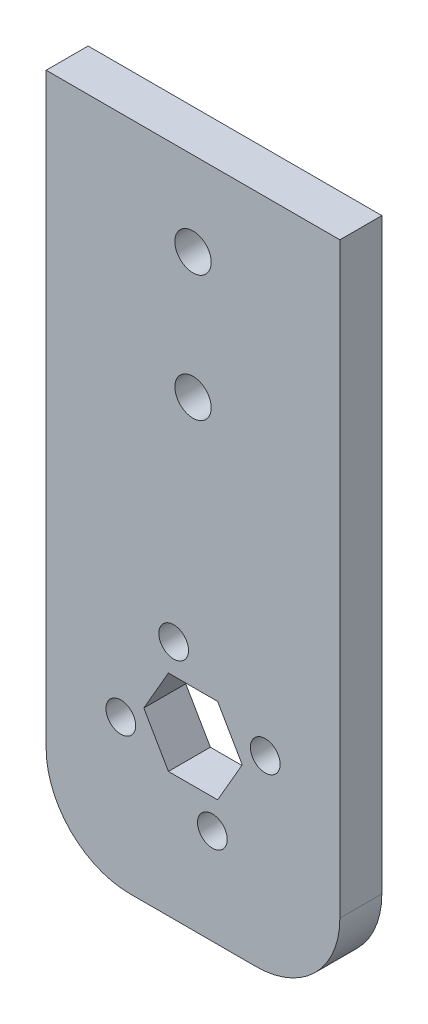
ISO-10303-21;
HEADER;
FILE_DESCRIPTION(('STEP AP214'),'2;1');
FILE_NAME('part.step','',(''),(''),'','','');
FILE_SCHEMA(('AUTOMOTIVE_DESIGN { 1 0 10303 214 1 1 1 1 }'));
ENDSEC;
DATA;
#1=APPLICATION_CONTEXT('core data for automotive mechanical design processes');
#2=APPLICATION_PROTOCOL_DEFINITION('international standard','automotive_design',2000,#1);
#3=PRODUCT_CONTEXT('',#1,'mechanical');
#4=PRODUCT('Part','Part','',(#3));
#5=PRODUCT_RELATED_PRODUCT_CATEGORY('part','',(#4));
#6=PRODUCT_DEFINITION_FORMATION('','',#4);
#7=PRODUCT_DEFINITION_CONTEXT('part definition',#1,'design');
#8=PRODUCT_DEFINITION('design','',#6,#7);
#9=PRODUCT_DEFINITION_SHAPE('','',#8);
#10=(LENGTH_UNIT() NAMED_UNIT(*) SI_UNIT(.MILLI.,.METRE.));
#11=(NAMED_UNIT(*) PLANE_ANGLE_UNIT() SI_UNIT($,.RADIAN.));
#12=(NAMED_UNIT(*) SI_UNIT($,.STERADIAN.) SOLID_ANGLE_UNIT());
#13=UNCERTAINTY_MEASURE_WITH_UNIT(LENGTH_MEASURE(1.E-05),#10,'distance_accuracy_value','');
#14=(GEOMETRIC_REPRESENTATION_CONTEXT(3) GLOBAL_UNCERTAINTY_ASSIGNED_CONTEXT((#13)) GLOBAL_UNIT_ASSIGNED_CONTEXT((#10,
#11,#12)) REPRESENTATION_CONTEXT('',''));
#15=CARTESIAN_POINT('',(0.,0.,0.));
#16=DIRECTION('',(0.,0.,1.));
#17=DIRECTION('',(1.,0.,0.));
#18=AXIS2_PLACEMENT_3D('',#15,#16,#17);
#19=CARTESIAN_POINT('',(0.,0.,6.35));
#20=DIRECTION('',(-1.,0.,0.));
#21=DIRECTION('',(0.,0.,1.));
#22=AXIS2_PLACEMENT_3D('',#19,#20,#21);
#23=PLANE('',#22);
#24=DIRECTION('',(0.,1.,0.));
#25=VECTOR('',#24,1.);
#26=CARTESIAN_POINT('',(0.,0.,6.35));
#27=LINE('',#26,#25);
#28=CARTESIAN_POINT('',(0.,12.7,6.35));
#29=VERTEX_POINT('',#28);
#30=CARTESIAN_POINT('',(0.,101.6,6.35));
#31=VERTEX_POINT('',#30);
#32=EDGE_CURVE('E194',#29,#31,#27,.T.);
#33=ORIENTED_EDGE('',*,*,#32,.F.);
#34=DIRECTION('',(0.,0.,-1.));
#35=VECTOR('',#34,1.);
#36=CARTESIAN_POINT('',(0.,12.7,6.35));
#37=LINE('',#36,#35);
#38=CARTESIAN_POINT('',(0.,12.7,0.));
#39=VERTEX_POINT('',#38);
#40=EDGE_CURVE('E11',#29,#39,#37,.T.);
#41=ORIENTED_EDGE('',*,*,#40,.T.);
#42=DIRECTION('',(0.,1.,0.));
#43=VECTOR('',#42,1.);
#44=CARTESIAN_POINT('',(0.,0.,0.));
#45=LINE('',#44,#43);
#46=CARTESIAN_POINT('',(0.,101.6,0.));
#47=VERTEX_POINT('',#46);
#48=EDGE_CURVE('E193',#39,#47,#45,.T.);
#49=ORIENTED_EDGE('',*,*,#48,.T.);
#50=DIRECTION('',(0.,0.,-1.));
#51=VECTOR('',#50,1.);
#52=CARTESIAN_POINT('',(0.,101.6,6.35));
#53=LINE('',#52,#51);
#54=EDGE_CURVE('E216',#31,#47,#53,.T.);
#55=ORIENTED_EDGE('',*,*,#54,.F.);
#56=EDGE_LOOP('',(#33,#41,#49,#55));
#57=FACE_BOUND('',#56,.T.);
#58=ADVANCED_FACE('F37',(#57),#23,.F.);
#59=CARTESIAN_POINT('',(0.,101.6,6.35));
#60=DIRECTION('',(0.,-1.,0.));
#61=DIRECTION('',(0.,0.,-1.));
#62=AXIS2_PLACEMENT_3D('',#59,#60,#61);
#63=PLANE('',#62);
#64=DIRECTION('',(-1.,0.,0.));
#65=VECTOR('',#64,1.);
#66=CARTESIAN_POINT('',(0.,101.6,0.));
#67=LINE('',#66,#65);
#68=CARTESIAN_POINT('',(-44.45,101.6,0.));
#69=VERTEX_POINT('',#68);
#70=EDGE_CURVE('E207',#47,#69,#67,.T.);
#71=ORIENTED_EDGE('',*,*,#70,.T.);
#72=DIRECTION('',(0.,0.,-1.));
#73=VECTOR('',#72,1.);
#74=CARTESIAN_POINT('',(-44.45,101.6,6.35));
#75=LINE('',#74,#73);
#76=CARTESIAN_POINT('',(-44.45,101.6,6.35));
#77=VERTEX_POINT('',#76);
#78=EDGE_CURVE('E205',#77,#69,#75,.T.);
#79=ORIENTED_EDGE('',*,*,#78,.F.);
#80=DIRECTION('',(-1.,0.,0.));
#81=VECTOR('',#80,1.);
#82=CARTESIAN_POINT('',(0.,101.6,6.35));
#83=LINE('',#82,#81);
#84=EDGE_CURVE('E196',#31,#77,#83,.T.);
#85=ORIENTED_EDGE('',*,*,#84,.F.);
#86=ORIENTED_EDGE('',*,*,#54,.T.);
#87=EDGE_LOOP('',(#71,#79,#85,#86));
#88=FACE_BOUND('',#87,.T.);
#89=ADVANCED_FACE('F253',(#88),#63,.F.);
#90=CARTESIAN_POINT('',(-44.45,0.,6.35));
#91=DIRECTION('',(1.,0.,0.));
#92=DIRECTION('',(0.,0.,-1.));
#93=AXIS2_PLACEMENT_3D('',#90,#91,#92);
#94=PLANE('',#93);
#95=DIRECTION('',(0.,-1.,0.));
#96=VECTOR('',#95,1.);
#97=CARTESIAN_POINT('',(-44.45,0.,0.));
#98=LINE('',#97,#96);
#99=CARTESIAN_POINT('',(-44.45,12.7,0.));
#100=VERTEX_POINT('',#99);
#101=EDGE_CURVE('E209',#69,#100,#98,.T.);
#102=ORIENTED_EDGE('',*,*,#101,.T.);
#103=DIRECTION('',(0.,0.,-1.));
#104=VECTOR('',#103,1.);
#105=CARTESIAN_POINT('',(-44.45,12.7,6.35));
#106=LINE('',#105,#104);
#107=CARTESIAN_POINT('',(-44.45,12.7,6.35));
#108=VERTEX_POINT('',#107);
#109=EDGE_CURVE('E228',#100,#108,#106,.F.);
#110=ORIENTED_EDGE('',*,*,#109,.T.);
#111=DIRECTION('',(0.,-1.,0.));
#112=VECTOR('',#111,1.);
#113=CARTESIAN_POINT('',(-44.45,0.,6.35));
#114=LINE('',#113,#112);
#115=EDGE_CURVE('E199',#77,#108,#114,.T.);
#116=ORIENTED_EDGE('',*,*,#115,.F.);
#117=ORIENTED_EDGE('',*,*,#78,.T.);
#118=EDGE_LOOP('',(#102,#110,#116,#117));
#119=FACE_BOUND('',#118,.T.);
#120=ADVANCED_FACE('F249',(#119),#94,.F.);
#121=CARTESIAN_POINT('',(0.,0.,6.35));
#122=DIRECTION('',(0.,1.,0.));
#123=DIRECTION('',(0.,0.,1.));
#124=AXIS2_PLACEMENT_3D('',#121,#122,#123);
#125=PLANE('',#124);
#126=DIRECTION('',(1.,0.,0.));
#127=VECTOR('',#126,1.);
#128=CARTESIAN_POINT('',(0.,0.,6.35));
#129=LINE('',#128,#127);
#130=CARTESIAN_POINT('',(-31.75,0.,6.35));
#131=VERTEX_POINT('',#130);
#132=CARTESIAN_POINT('',(-12.7,0.,6.35));
#133=VERTEX_POINT('',#132);
#134=EDGE_CURVE('E202',#131,#133,#129,.T.);
#135=ORIENTED_EDGE('',*,*,#134,.F.);
#136=DIRECTION('',(0.,0.,-1.));
#137=VECTOR('',#136,1.);
#138=CARTESIAN_POINT('',(-31.75,0.,6.35));
#139=LINE('',#138,#137);
#140=CARTESIAN_POINT('',(-31.75,0.,0.));
#141=VERTEX_POINT('',#140);
#142=EDGE_CURVE('E221',#131,#141,#139,.T.);
#143=ORIENTED_EDGE('',*,*,#142,.T.);
#144=DIRECTION('',(1.,0.,0.));
#145=VECTOR('',#144,1.);
#146=CARTESIAN_POINT('',(0.,0.,0.));
#147=LINE('',#146,#145);
#148=CARTESIAN_POINT('',(-12.7,0.,0.));
#149=VERTEX_POINT('',#148);
#150=EDGE_CURVE('E197',#141,#149,#147,.T.);
#151=ORIENTED_EDGE('',*,*,#150,.T.);
#152=DIRECTION('',(0.,0.,-1.));
#153=VECTOR('',#152,1.);
#154=CARTESIAN_POINT('',(-12.7,0.,6.35));
#155=LINE('',#154,#153);
#156=EDGE_CURVE('E219',#149,#133,#155,.F.);
#157=ORIENTED_EDGE('',*,*,#156,.T.);
#158=EDGE_LOOP('',(#135,#143,#151,#157));
#159=FACE_BOUND('',#158,.T.);
#160=ADVANCED_FACE('F241',(#159),#125,.F.);
#161=CARTESIAN_POINT('',(0.,0.,6.35));
#162=DIRECTION('',(0.,0.,1.));
#163=DIRECTION('',(1.,0.,0.));
#164=AXIS2_PLACEMENT_3D('',#161,#162,#163);
#165=PLANE('',#164);
#166=CARTESIAN_POINT('',(-11.2967967697244,28.3282032302755,6.35));
#167=DIRECTION('',(0.,0.,-1.));
#168=DIRECTION('',(-1.,0.,0.));
#169=AXIS2_PLACEMENT_3D('',#166,#167,#168);
#170=CIRCLE('',#169,2.25);
#171=CARTESIAN_POINT('',(-13.5467967697244,28.3282032302755,6.35));
#172=VERTEX_POINT('',#171);
#173=EDGE_CURVE('E328',#172,#172,#170,.T.);
#174=ORIENTED_EDGE('',*,*,#173,.T.);
#175=EDGE_LOOP('',(#174));
#176=FACE_BOUND('',#175,.T.);
#177=CARTESIAN_POINT('',(-25.1532032302754,36.3282032302756,6.35));
#178=DIRECTION('',(0.,0.,-1.));
#179=DIRECTION('',(-1.,0.,0.));
#180=AXIS2_PLACEMENT_3D('',#177,#178,#179);
#181=CIRCLE('',#180,2.25);
#182=CARTESIAN_POINT('',(-27.4032032302754,36.3282032302756,6.35));
#183=VERTEX_POINT('',#182);
#184=EDGE_CURVE('E338',#183,#183,#181,.T.);
#185=ORIENTED_EDGE('',*,*,#184,.T.);
#186=EDGE_LOOP('',(#185));
#187=FACE_BOUND('',#186,.T.);
#188=CARTESIAN_POINT('',(-33.1532032302755,22.4717967697245,6.35));
#189=DIRECTION('',(0.,0.,-1.));
#190=DIRECTION('',(-1.,0.,0.));
#191=AXIS2_PLACEMENT_3D('',#188,#189,#190);
#192=CIRCLE('',#191,2.25);
#193=CARTESIAN_POINT('',(-35.4032032302755,22.4717967697245,6.35));
#194=VERTEX_POINT('',#193);
#195=EDGE_CURVE('E344',#194,#194,#192,.T.);
#196=ORIENTED_EDGE('',*,*,#195,.T.);
#197=EDGE_LOOP('',(#196));
#198=FACE_BOUND('',#197,.T.);
#199=CARTESIAN_POINT('',(-19.2967967697245,14.4717967697245,6.35));
#200=DIRECTION('',(0.,0.,-1.));
#201=DIRECTION('',(-1.,0.,0.));
#202=AXIS2_PLACEMENT_3D('',#199,#200,#201);
#203=CIRCLE('',#202,2.25);
#204=CARTESIAN_POINT('',(-21.5467967697245,14.4717967697245,6.35));
#205=VERTEX_POINT('',#204);
#206=EDGE_CURVE('E151',#205,#205,#203,.T.);
#207=ORIENTED_EDGE('',*,*,#206,.T.);
#208=EDGE_LOOP('',(#207));
#209=FACE_BOUND('',#208,.T.);
#210=DIRECTION('',(0.500000000000001,0.866025403784438,0.));
#211=VECTOR('',#210,1.);
#212=CARTESIAN_POINT('',(-18.5010907637269,18.95,6.35));
#213=LINE('',#212,#211);
#214=CARTESIAN_POINT('',(-18.5010907637269,18.95,6.35));
#215=VERTEX_POINT('',#214);
#216=CARTESIAN_POINT('',(-14.7771815274538,25.4,6.35));
#217=VERTEX_POINT('',#216);
#218=EDGE_CURVE('E52',#215,#217,#213,.T.);
#219=ORIENTED_EDGE('',*,*,#218,.F.);
#220=DIRECTION('',(1.,0.,0.));
#221=VECTOR('',#220,1.);
#222=CARTESIAN_POINT('',(-25.9489092362731,18.95,6.35));
#223=LINE('',#222,#221);
#224=CARTESIAN_POINT('',(-25.9489092362731,18.95,6.35));
#225=VERTEX_POINT('',#224);
#226=EDGE_CURVE('E145',#225,#215,#223,.T.);
#227=ORIENTED_EDGE('',*,*,#226,.F.);
#228=DIRECTION('',(0.499999999999999,-0.866025403784439,0.));
#229=VECTOR('',#228,1.);
#230=CARTESIAN_POINT('',(-29.6728184725462,25.4,6.35));
#231=LINE('',#230,#229);
#232=CARTESIAN_POINT('',(-29.6728184725462,25.4,6.35));
#233=VERTEX_POINT('',#232);
#234=EDGE_CURVE('E148',#233,#225,#231,.T.);
#235=ORIENTED_EDGE('',*,*,#234,.F.);
#236=DIRECTION('',(-0.500000000000001,-0.866025403784438,0.));
#237=VECTOR('',#236,1.);
#238=CARTESIAN_POINT('',(-25.9489092362731,31.85,6.35));
#239=LINE('',#238,#237);
#240=CARTESIAN_POINT('',(-25.9489092362731,31.85,6.35));
#241=VERTEX_POINT('',#240);
#242=EDGE_CURVE('E167',#241,#233,#239,.T.);
#243=ORIENTED_EDGE('',*,*,#242,.F.);
#244=DIRECTION('',(-1.,0.,0.));
#245=VECTOR('',#244,1.);
#246=CARTESIAN_POINT('',(-18.5010907637269,31.85,6.35));
#247=LINE('',#246,#245);
#248=CARTESIAN_POINT('',(-18.5010907637269,31.85,6.35));
#249=VERTEX_POINT('',#248);
#250=EDGE_CURVE('E164',#249,#241,#247,.T.);
#251=ORIENTED_EDGE('',*,*,#250,.F.);
#252=DIRECTION('',(-0.499999999999999,0.866025403784439,0.));
#253=VECTOR('',#252,1.);
#254=CARTESIAN_POINT('',(-14.7771815274538,25.4,6.35));
#255=LINE('',#254,#253);
#256=EDGE_CURVE('E162',#217,#249,#255,.T.);
#257=ORIENTED_EDGE('',*,*,#256,.F.);
#258=EDGE_LOOP('',(#219,#227,#235,#243,#251,#257));
#259=FACE_BOUND('',#258,.T.);
#260=CARTESIAN_POINT('',(-22.225,88.9,6.35));
#261=DIRECTION('',(0.,0.,-1.));
#262=DIRECTION('',(-1.,0.,0.));
#263=AXIS2_PLACEMENT_3D('',#260,#261,#262);
#264=CIRCLE('',#263,2.75);
#265=CARTESIAN_POINT('',(-24.975,88.9,6.35));
#266=VERTEX_POINT('',#265);
#267=EDGE_CURVE('E184',#266,#266,#264,.T.);
#268=ORIENTED_EDGE('',*,*,#267,.T.);
#269=EDGE_LOOP('',(#268));
#270=FACE_BOUND('',#269,.T.);
#271=CARTESIAN_POINT('',(-22.225,69.85,6.35));
#272=DIRECTION('',(0.,0.,-1.));
#273=DIRECTION('',(-1.,0.,0.));
#274=AXIS2_PLACEMENT_3D('',#271,#272,#273);
#275=CIRCLE('',#274,2.75);
#276=CARTESIAN_POINT('',(-24.975,69.85,6.35));
#277=VERTEX_POINT('',#276);
#278=EDGE_CURVE('E190',#277,#277,#275,.T.);
#279=ORIENTED_EDGE('',*,*,#278,.T.);
#280=EDGE_LOOP('',(#279));
#281=FACE_BOUND('',#280,.T.);
#282=ORIENTED_EDGE('',*,*,#115,.T.);
#283=CARTESIAN_POINT('',(-31.75,12.7,6.35));
#284=DIRECTION('',(0.,0.,1.));
#285=DIRECTION('',(1.,0.,0.));
#286=AXIS2_PLACEMENT_3D('',#283,#284,#285);
#287=CIRCLE('',#286,12.7);
#288=EDGE_CURVE('E45',#108,#131,#287,.T.);
#289=ORIENTED_EDGE('',*,*,#288,.T.);
#290=ORIENTED_EDGE('',*,*,#134,.T.);
#291=CARTESIAN_POINT('',(-12.7,12.7,6.35));
#292=DIRECTION('',(0.,0.,1.));
#293=DIRECTION('',(1.,0.,0.));
#294=AXIS2_PLACEMENT_3D('',#291,#292,#293);
#295=CIRCLE('',#294,12.7);
#296=EDGE_CURVE('E230',#133,#29,#295,.T.);
#297=ORIENTED_EDGE('',*,*,#296,.T.);
#298=ORIENTED_EDGE('',*,*,#32,.T.);
#299=ORIENTED_EDGE('',*,*,#84,.T.);
#300=EDGE_LOOP('',(#282,#289,#290,#297,#298,#299));
#301=FACE_BOUND('',#300,.T.);
#302=ADVANCED_FACE('F234',(#176,#187,#198,#209,#259,#270,#281,#301),#165,.T.);
#303=CARTESIAN_POINT('',(0.,0.,0.));
#304=DIRECTION('',(0.,0.,1.));
#305=DIRECTION('',(1.,0.,0.));
#306=AXIS2_PLACEMENT_3D('',#303,#304,#305);
#307=PLANE('',#306);
#308=CARTESIAN_POINT('',(-11.2967967697244,28.3282032302755,0.));
#309=DIRECTION('',(0.,0.,-1.));
#310=DIRECTION('',(-1.,0.,0.));
#311=AXIS2_PLACEMENT_3D('',#308,#309,#310);
#312=CIRCLE('',#311,2.25);
#313=CARTESIAN_POINT('',(-13.5467967697244,28.3282032302755,0.));
#314=VERTEX_POINT('',#313);
#315=EDGE_CURVE('E331',#314,#314,#312,.T.);
#316=ORIENTED_EDGE('',*,*,#315,.F.);
#317=EDGE_LOOP('',(#316));
#318=FACE_BOUND('',#317,.T.);
#319=CARTESIAN_POINT('',(-25.1532032302754,36.3282032302756,0.));
#320=DIRECTION('',(0.,0.,-1.));
#321=DIRECTION('',(-1.,0.,0.));
#322=AXIS2_PLACEMENT_3D('',#319,#320,#321);
#323=CIRCLE('',#322,2.25);
#324=CARTESIAN_POINT('',(-27.4032032302754,36.3282032302756,0.));
#325=VERTEX_POINT('',#324);
#326=EDGE_CURVE('E333',#325,#325,#323,.T.);
#327=ORIENTED_EDGE('',*,*,#326,.F.);
#328=EDGE_LOOP('',(#327));
#329=FACE_BOUND('',#328,.T.);
#330=CARTESIAN_POINT('',(-33.1532032302755,22.4717967697245,0.));
#331=DIRECTION('',(0.,0.,-1.));
#332=DIRECTION('',(-1.,0.,0.));
#333=AXIS2_PLACEMENT_3D('',#330,#331,#332);
#334=CIRCLE('',#333,2.25);
#335=CARTESIAN_POINT('',(-35.4032032302755,22.4717967697245,0.));
#336=VERTEX_POINT('',#335);
#337=EDGE_CURVE('E341',#336,#336,#334,.T.);
#338=ORIENTED_EDGE('',*,*,#337,.F.);
#339=EDGE_LOOP('',(#338));
#340=FACE_BOUND('',#339,.T.);
#341=CARTESIAN_POINT('',(-19.2967967697245,14.4717967697245,0.));
#342=DIRECTION('',(0.,0.,-1.));
#343=DIRECTION('',(-1.,0.,0.));
#344=AXIS2_PLACEMENT_3D('',#341,#342,#343);
#345=CIRCLE('',#344,2.25);
#346=CARTESIAN_POINT('',(-21.5467967697245,14.4717967697245,0.));
#347=VERTEX_POINT('',#346);
#348=EDGE_CURVE('E346',#347,#347,#345,.T.);
#349=ORIENTED_EDGE('',*,*,#348,.F.);
#350=EDGE_LOOP('',(#349));
#351=FACE_BOUND('',#350,.T.);
#352=DIRECTION('',(1.,0.,0.));
#353=VECTOR('',#352,1.);
#354=CARTESIAN_POINT('',(-25.9489092362731,18.95,0.));
#355=LINE('',#354,#353);
#356=CARTESIAN_POINT('',(-25.9489092362731,18.95,0.));
#357=VERTEX_POINT('',#356);
#358=CARTESIAN_POINT('',(-18.5010907637269,18.95,0.));
#359=VERTEX_POINT('',#358);
#360=EDGE_CURVE('E134',#357,#359,#355,.T.);
#361=ORIENTED_EDGE('',*,*,#360,.T.);
#362=DIRECTION('',(0.500000000000001,0.866025403784438,0.));
#363=VECTOR('',#362,1.);
#364=CARTESIAN_POINT('',(-18.5010907637269,18.95,0.));
#365=LINE('',#364,#363);
#366=CARTESIAN_POINT('',(-14.7771815274538,25.4,0.));
#367=VERTEX_POINT('',#366);
#368=EDGE_CURVE('E128',#359,#367,#365,.T.);
#369=ORIENTED_EDGE('',*,*,#368,.T.);
#370=DIRECTION('',(-0.499999999999999,0.866025403784439,0.));
#371=VECTOR('',#370,1.);
#372=CARTESIAN_POINT('',(-14.7771815274538,25.4,0.));
#373=LINE('',#372,#371);
#374=CARTESIAN_POINT('',(-18.5010907637269,31.85,0.));
#375=VERTEX_POINT('',#374);
#376=EDGE_CURVE('E137',#367,#375,#373,.T.);
#377=ORIENTED_EDGE('',*,*,#376,.T.);
#378=DIRECTION('',(-1.,0.,0.));
#379=VECTOR('',#378,1.);
#380=CARTESIAN_POINT('',(-18.5010907637269,31.85,0.));
#381=LINE('',#380,#379);
#382=CARTESIAN_POINT('',(-25.9489092362731,31.85,0.));
#383=VERTEX_POINT('',#382);
#384=EDGE_CURVE('E60',#375,#383,#381,.T.);
#385=ORIENTED_EDGE('',*,*,#384,.T.);
#386=DIRECTION('',(-0.500000000000001,-0.866025403784438,0.));
#387=VECTOR('',#386,1.);
#388=CARTESIAN_POINT('',(-25.9489092362731,31.85,0.));
#389=LINE('',#388,#387);
#390=CARTESIAN_POINT('',(-29.6728184725462,25.4,0.));
#391=VERTEX_POINT('',#390);
#392=EDGE_CURVE('E155',#383,#391,#389,.T.);
#393=ORIENTED_EDGE('',*,*,#392,.T.);
#394=DIRECTION('',(0.499999999999999,-0.866025403784439,0.));
#395=VECTOR('',#394,1.);
#396=CARTESIAN_POINT('',(-29.6728184725462,25.4,0.));
#397=LINE('',#396,#395);
#398=EDGE_CURVE('E158',#391,#357,#397,.T.);
#399=ORIENTED_EDGE('',*,*,#398,.T.);
#400=EDGE_LOOP('',(#361,#369,#377,#385,#393,#399));
#401=FACE_BOUND('',#400,.T.);
#402=CARTESIAN_POINT('',(-22.225,88.9,0.));
#403=DIRECTION('',(0.,0.,-1.));
#404=DIRECTION('',(-1.,0.,0.));
#405=AXIS2_PLACEMENT_3D('',#402,#403,#404);
#406=CIRCLE('',#405,2.75);
#407=CARTESIAN_POINT('',(-24.975,88.9,0.));
#408=VERTEX_POINT('',#407);
#409=EDGE_CURVE('E174',#408,#408,#406,.T.);
#410=ORIENTED_EDGE('',*,*,#409,.F.);
#411=EDGE_LOOP('',(#410));
#412=FACE_BOUND('',#411,.T.);
#413=CARTESIAN_POINT('',(-22.225,69.85,0.));
#414=DIRECTION('',(0.,0.,-1.));
#415=DIRECTION('',(-1.,0.,0.));
#416=AXIS2_PLACEMENT_3D('',#413,#414,#415);
#417=CIRCLE('',#416,2.75);
#418=CARTESIAN_POINT('',(-24.975,69.85,0.));
#419=VERTEX_POINT('',#418);
#420=EDGE_CURVE('E187',#419,#419,#417,.T.);
#421=ORIENTED_EDGE('',*,*,#420,.F.);
#422=EDGE_LOOP('',(#421));
#423=FACE_BOUND('',#422,.T.);
#424=ORIENTED_EDGE('',*,*,#150,.F.);
#425=CARTESIAN_POINT('',(-31.75,12.7,0.));
#426=DIRECTION('',(0.,0.,1.));
#427=DIRECTION('',(1.,0.,0.));
#428=AXIS2_PLACEMENT_3D('',#425,#426,#427);
#429=CIRCLE('',#428,12.7);
#430=EDGE_CURVE('E226',#141,#100,#429,.F.);
#431=ORIENTED_EDGE('',*,*,#430,.T.);
#432=ORIENTED_EDGE('',*,*,#101,.F.);
#433=ORIENTED_EDGE('',*,*,#70,.F.);
#434=ORIENTED_EDGE('',*,*,#48,.F.);
#435=CARTESIAN_POINT('',(-12.7,12.7,0.));
#436=DIRECTION('',(0.,0.,1.));
#437=DIRECTION('',(1.,0.,0.));
#438=AXIS2_PLACEMENT_3D('',#435,#436,#437);
#439=CIRCLE('',#438,12.7);
#440=EDGE_CURVE('E224',#39,#149,#439,.F.);
#441=ORIENTED_EDGE('',*,*,#440,.T.);
#442=EDGE_LOOP('',(#424,#431,#432,#433,#434,#441));
#443=FACE_BOUND('',#442,.T.);
#444=ADVANCED_FACE('F141',(#318,#329,#340,#351,#401,#412,#423,#443),#307,.F.);
#445=CARTESIAN_POINT('',(-31.75,12.7,6.35));
#446=DIRECTION('',(0.,0.,-1.));
#447=DIRECTION('',(-1.,0.,0.));
#448=AXIS2_PLACEMENT_3D('',#445,#446,#447);
#449=CYLINDRICAL_SURFACE('',#448,12.7);
#450=ORIENTED_EDGE('',*,*,#288,.F.);
#451=ORIENTED_EDGE('',*,*,#109,.F.);
#452=ORIENTED_EDGE('',*,*,#430,.F.);
#453=ORIENTED_EDGE('',*,*,#142,.F.);
#454=EDGE_LOOP('',(#450,#451,#452,#453));
#455=FACE_BOUND('',#454,.T.);
#456=ADVANCED_FACE('F244',(#455),#449,.T.);
#457=CARTESIAN_POINT('',(-12.7,12.7,6.35));
#458=DIRECTION('',(0.,0.,-1.));
#459=DIRECTION('',(-1.,0.,0.));
#460=AXIS2_PLACEMENT_3D('',#457,#458,#459);
#461=CYLINDRICAL_SURFACE('',#460,12.7);
#462=ORIENTED_EDGE('',*,*,#296,.F.);
#463=ORIENTED_EDGE('',*,*,#156,.F.);
#464=ORIENTED_EDGE('',*,*,#440,.F.);
#465=ORIENTED_EDGE('',*,*,#40,.F.);
#466=EDGE_LOOP('',(#462,#463,#464,#465));
#467=FACE_BOUND('',#466,.T.);
#468=ADVANCED_FACE('F39',(#467),#461,.T.);
#469=CARTESIAN_POINT('',(-22.225,69.85,0.));
#470=DIRECTION('',(0.,0.,-1.));
#471=DIRECTION('',(-1.,0.,0.));
#472=AXIS2_PLACEMENT_3D('',#469,#470,#471);
#473=CYLINDRICAL_SURFACE('',#472,2.75);
#474=ORIENTED_EDGE('',*,*,#278,.F.);
#475=EDGE_LOOP('',(#474));
#476=FACE_BOUND('',#475,.T.);
#477=ORIENTED_EDGE('',*,*,#420,.T.);
#478=EDGE_LOOP('',(#477));
#479=FACE_BOUND('',#478,.T.);
#480=ADVANCED_FACE('F261',(#476,#479),#473,.F.);
#481=CARTESIAN_POINT('',(-22.225,88.9,0.));
#482=DIRECTION('',(0.,0.,-1.));
#483=DIRECTION('',(-1.,0.,0.));
#484=AXIS2_PLACEMENT_3D('',#481,#482,#483);
#485=CYLINDRICAL_SURFACE('',#484,2.75);
#486=ORIENTED_EDGE('',*,*,#267,.F.);
#487=EDGE_LOOP('',(#486));
#488=FACE_BOUND('',#487,.T.);
#489=ORIENTED_EDGE('',*,*,#409,.T.);
#490=EDGE_LOOP('',(#489));
#491=FACE_BOUND('',#490,.T.);
#492=ADVANCED_FACE('F266',(#488,#491),#485,.F.);
#493=CARTESIAN_POINT('',(-18.5010907637269,18.95,0.));
#494=DIRECTION('',(0.866025403784438,-0.500000000000001,0.));
#495=DIRECTION('',(0.500000000000001,0.866025403784438,0.));
#496=AXIS2_PLACEMENT_3D('',#493,#494,#495);
#497=PLANE('',#496);
#498=ORIENTED_EDGE('',*,*,#218,.T.);
#499=DIRECTION('',(0.,0.,1.));
#500=VECTOR('',#499,1.);
#501=CARTESIAN_POINT('',(-14.7771815274538,25.4,0.));
#502=LINE('',#501,#500);
#503=EDGE_CURVE('E124',#367,#217,#502,.T.);
#504=ORIENTED_EDGE('',*,*,#503,.F.);
#505=ORIENTED_EDGE('',*,*,#368,.F.);
#506=DIRECTION('',(0.,0.,1.));
#507=VECTOR('',#506,1.);
#508=CARTESIAN_POINT('',(-18.5010907637269,18.95,0.));
#509=LINE('',#508,#507);
#510=EDGE_CURVE('E172',#359,#215,#509,.T.);
#511=ORIENTED_EDGE('',*,*,#510,.T.);
#512=EDGE_LOOP('',(#498,#504,#505,#511));
#513=FACE_BOUND('',#512,.T.);
#514=ADVANCED_FACE('F126',(#513),#497,.F.);
#515=CARTESIAN_POINT('',(-25.9489092362731,18.95,0.));
#516=DIRECTION('',(0.,-1.,0.));
#517=DIRECTION('',(1.,0.,0.));
#518=AXIS2_PLACEMENT_3D('',#515,#516,#517);
#519=PLANE('',#518);
#520=ORIENTED_EDGE('',*,*,#226,.T.);
#521=ORIENTED_EDGE('',*,*,#510,.F.);
#522=ORIENTED_EDGE('',*,*,#360,.F.);
#523=DIRECTION('',(0.,0.,1.));
#524=VECTOR('',#523,1.);
#525=CARTESIAN_POINT('',(-25.9489092362731,18.95,0.));
#526=LINE('',#525,#524);
#527=EDGE_CURVE('E175',#357,#225,#526,.T.);
#528=ORIENTED_EDGE('',*,*,#527,.T.);
#529=EDGE_LOOP('',(#520,#521,#522,#528));
#530=FACE_BOUND('',#529,.T.);
#531=ADVANCED_FACE('F291',(#530),#519,.F.);
#532=CARTESIAN_POINT('',(-29.6728184725462,25.4,0.));
#533=DIRECTION('',(-0.866025403784439,-0.499999999999999,0.));
#534=DIRECTION('',(0.499999999999999,-0.866025403784439,0.));
#535=AXIS2_PLACEMENT_3D('',#532,#533,#534);
#536=PLANE('',#535);
#537=ORIENTED_EDGE('',*,*,#234,.T.);
#538=ORIENTED_EDGE('',*,*,#527,.F.);
#539=ORIENTED_EDGE('',*,*,#398,.F.);
#540=DIRECTION('',(0.,0.,1.));
#541=VECTOR('',#540,1.);
#542=CARTESIAN_POINT('',(-29.6728184725462,25.4,0.));
#543=LINE('',#542,#541);
#544=EDGE_CURVE('E177',#391,#233,#543,.T.);
#545=ORIENTED_EDGE('',*,*,#544,.T.);
#546=EDGE_LOOP('',(#537,#538,#539,#545));
#547=FACE_BOUND('',#546,.T.);
#548=ADVANCED_FACE('F301',(#547),#536,.F.);
#549=CARTESIAN_POINT('',(-25.9489092362731,31.85,0.));
#550=DIRECTION('',(-0.866025403784438,0.500000000000001,0.));
#551=DIRECTION('',(-0.500000000000001,-0.866025403784438,0.));
#552=AXIS2_PLACEMENT_3D('',#549,#550,#551);
#553=PLANE('',#552);
#554=ORIENTED_EDGE('',*,*,#242,.T.);
#555=ORIENTED_EDGE('',*,*,#544,.F.);
#556=ORIENTED_EDGE('',*,*,#392,.F.);
#557=DIRECTION('',(0.,0.,1.));
#558=VECTOR('',#557,1.);
#559=CARTESIAN_POINT('',(-25.9489092362731,31.85,0.));
#560=LINE('',#559,#558);
#561=EDGE_CURVE('E179',#383,#241,#560,.T.);
#562=ORIENTED_EDGE('',*,*,#561,.T.);
#563=EDGE_LOOP('',(#554,#555,#556,#562));
#564=FACE_BOUND('',#563,.T.);
#565=ADVANCED_FACE('F298',(#564),#553,.F.);
#566=CARTESIAN_POINT('',(-18.5010907637269,31.85,0.));
#567=DIRECTION('',(0.,1.,0.));
#568=DIRECTION('',(-1.,0.,0.));
#569=AXIS2_PLACEMENT_3D('',#566,#567,#568);
#570=PLANE('',#569);
#571=ORIENTED_EDGE('',*,*,#250,.T.);
#572=ORIENTED_EDGE('',*,*,#561,.F.);
#573=ORIENTED_EDGE('',*,*,#384,.F.);
#574=DIRECTION('',(0.,0.,1.));
#575=VECTOR('',#574,1.);
#576=CARTESIAN_POINT('',(-18.5010907637269,31.85,0.));
#577=LINE('',#576,#575);
#578=EDGE_CURVE('E133',#375,#249,#577,.T.);
#579=ORIENTED_EDGE('',*,*,#578,.T.);
#580=EDGE_LOOP('',(#571,#572,#573,#579));
#581=FACE_BOUND('',#580,.T.);
#582=ADVANCED_FACE('F295',(#581),#570,.F.);
#583=CARTESIAN_POINT('',(-14.7771815274538,25.4,0.));
#584=DIRECTION('',(0.866025403784439,0.499999999999999,0.));
#585=DIRECTION('',(-0.499999999999999,0.866025403784439,0.));
#586=AXIS2_PLACEMENT_3D('',#583,#584,#585);
#587=PLANE('',#586);
#588=ORIENTED_EDGE('',*,*,#256,.T.);
#589=ORIENTED_EDGE('',*,*,#578,.F.);
#590=ORIENTED_EDGE('',*,*,#376,.F.);
#591=ORIENTED_EDGE('',*,*,#503,.T.);
#592=EDGE_LOOP('',(#588,#589,#590,#591));
#593=FACE_BOUND('',#592,.T.);
#594=ADVANCED_FACE('F138',(#593),#587,.F.);
#595=CARTESIAN_POINT('',(-19.2967967697245,14.4717967697245,0.));
#596=DIRECTION('',(0.,0.,-1.));
#597=DIRECTION('',(-1.,0.,0.));
#598=AXIS2_PLACEMENT_3D('',#595,#596,#597);
#599=CYLINDRICAL_SURFACE('',#598,2.25);
#600=ORIENTED_EDGE('',*,*,#206,.F.);
#601=EDGE_LOOP('',(#600));
#602=FACE_BOUND('',#601,.T.);
#603=ORIENTED_EDGE('',*,*,#348,.T.);
#604=EDGE_LOOP('',(#603));
#605=FACE_BOUND('',#604,.T.);
#606=ADVANCED_FACE('F294',(#602,#605),#599,.F.);
#607=CARTESIAN_POINT('',(-33.1532032302755,22.4717967697245,0.));
#608=DIRECTION('',(0.,0.,-1.));
#609=DIRECTION('',(-1.,0.,0.));
#610=AXIS2_PLACEMENT_3D('',#607,#608,#609);
#611=CYLINDRICAL_SURFACE('',#610,2.25);
#612=ORIENTED_EDGE('',*,*,#195,.F.);
#613=EDGE_LOOP('',(#612));
#614=FACE_BOUND('',#613,.T.);
#615=ORIENTED_EDGE('',*,*,#337,.T.);
#616=EDGE_LOOP('',(#615));
#617=FACE_BOUND('',#616,.T.);
#618=ADVANCED_FACE('F311',(#614,#617),#611,.F.);
#619=CARTESIAN_POINT('',(-25.1532032302754,36.3282032302756,0.));
#620=DIRECTION('',(0.,0.,-1.));
#621=DIRECTION('',(-1.,0.,0.));
#622=AXIS2_PLACEMENT_3D('',#619,#620,#621);
#623=CYLINDRICAL_SURFACE('',#622,2.25);
#624=ORIENTED_EDGE('',*,*,#184,.F.);
#625=EDGE_LOOP('',(#624));
#626=FACE_BOUND('',#625,.T.);
#627=ORIENTED_EDGE('',*,*,#326,.T.);
#628=EDGE_LOOP('',(#627));
#629=FACE_BOUND('',#628,.T.);
#630=ADVANCED_FACE('F315',(#626,#629),#623,.F.);
#631=CARTESIAN_POINT('',(-11.2967967697244,28.3282032302755,0.));
#632=DIRECTION('',(0.,0.,-1.));
#633=DIRECTION('',(-1.,0.,0.));
#634=AXIS2_PLACEMENT_3D('',#631,#632,#633);
#635=CYLINDRICAL_SURFACE('',#634,2.25);
#636=ORIENTED_EDGE('',*,*,#173,.F.);
#637=EDGE_LOOP('',(#636));
#638=FACE_BOUND('',#637,.T.);
#639=ORIENTED_EDGE('',*,*,#315,.T.);
#640=EDGE_LOOP('',(#639));
#641=FACE_BOUND('',#640,.T.);
#642=ADVANCED_FACE('F319',(#638,#641),#635,.F.);
#643=CLOSED_SHELL('',(#58,#89,#120,#160,#302,#444,#456,#468,#480,#492,#514,#531,#548,#565,#582,
#594,#606,#618,#630,#642));
#644=MANIFOLD_SOLID_BREP('B2',#643);
#645=ADVANCED_BREP_SHAPE_REPRESENTATION('',(#18,#644),#14);
#646=SHAPE_DEFINITION_REPRESENTATION(#9,#645);
ENDSEC;
END-ISO-10303-21;
